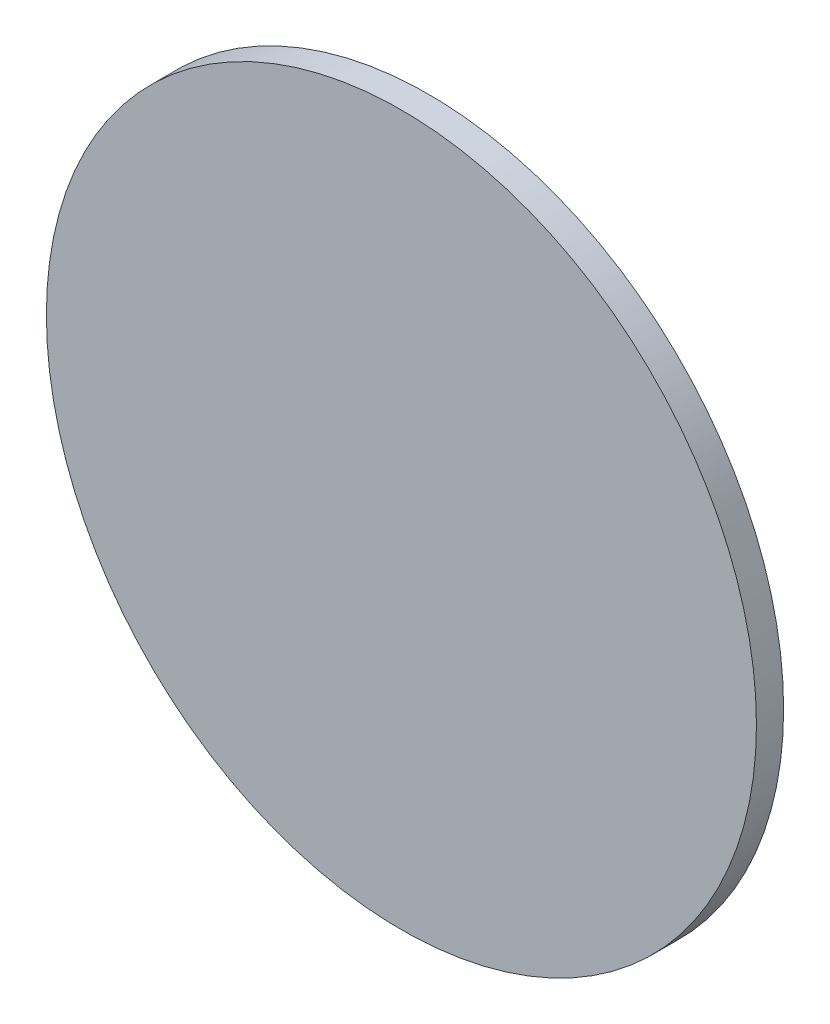
ISO-10303-21;
HEADER;
FILE_DESCRIPTION(('STEP AP214'),'2;1');
FILE_NAME('part.step','',(''),(''),'','','');
FILE_SCHEMA(('AUTOMOTIVE_DESIGN { 1 0 10303 214 1 1 1 1 }'));
ENDSEC;
DATA;
#1=APPLICATION_CONTEXT('core data for automotive mechanical design processes');
#2=APPLICATION_PROTOCOL_DEFINITION('international standard','automotive_design',2000,#1);
#3=PRODUCT_CONTEXT('',#1,'mechanical');
#4=PRODUCT('Part','Part','',(#3));
#5=PRODUCT_RELATED_PRODUCT_CATEGORY('part','',(#4));
#6=PRODUCT_DEFINITION_FORMATION('','',#4);
#7=PRODUCT_DEFINITION_CONTEXT('part definition',#1,'design');
#8=PRODUCT_DEFINITION('design','',#6,#7);
#9=PRODUCT_DEFINITION_SHAPE('','',#8);
#10=(LENGTH_UNIT() NAMED_UNIT(*) SI_UNIT(.MILLI.,.METRE.));
#11=(NAMED_UNIT(*) PLANE_ANGLE_UNIT() SI_UNIT($,.RADIAN.));
#12=(NAMED_UNIT(*) SI_UNIT($,.STERADIAN.) SOLID_ANGLE_UNIT());
#13=UNCERTAINTY_MEASURE_WITH_UNIT(LENGTH_MEASURE(1.E-05),#10,'distance_accuracy_value','');
#14=(GEOMETRIC_REPRESENTATION_CONTEXT(3) GLOBAL_UNCERTAINTY_ASSIGNED_CONTEXT((#13)) GLOBAL_UNIT_ASSIGNED_CONTEXT((#10,
#11,#12)) REPRESENTATION_CONTEXT('',''));
#15=CARTESIAN_POINT('',(0.,0.,0.));
#16=DIRECTION('',(0.,0.,1.));
#17=DIRECTION('',(1.,0.,0.));
#18=AXIS2_PLACEMENT_3D('',#15,#16,#17);
#19=CARTESIAN_POINT('',(0.,0.,1.6));
#20=DIRECTION('',(0.,0.,-1.));
#21=DIRECTION('',(-1.,0.,0.));
#22=AXIS2_PLACEMENT_3D('',#19,#20,#21);
#23=CYLINDRICAL_SURFACE('',#22,20.9);
#24=CARTESIAN_POINT('',(0.,0.,1.6));
#25=DIRECTION('',(0.,0.,1.));
#26=DIRECTION('',(1.,0.,0.));
#27=AXIS2_PLACEMENT_3D('',#24,#25,#26);
#28=CIRCLE('',#27,20.9);
#29=CARTESIAN_POINT('',(20.9,0.,1.6));
#30=VERTEX_POINT('',#29);
#31=EDGE_CURVE('E10',#30,#30,#28,.T.);
#32=ORIENTED_EDGE('',*,*,#31,.F.);
#33=EDGE_LOOP('',(#32));
#34=FACE_BOUND('',#33,.T.);
#35=CARTESIAN_POINT('',(0.,0.,0.));
#36=DIRECTION('',(0.,0.,1.));
#37=DIRECTION('',(1.,0.,0.));
#38=AXIS2_PLACEMENT_3D('',#35,#36,#37);
#39=CIRCLE('',#38,20.9);
#40=CARTESIAN_POINT('',(20.9,0.,0.));
#41=VERTEX_POINT('',#40);
#42=EDGE_CURVE('E35',#41,#41,#39,.T.);
#43=ORIENTED_EDGE('',*,*,#42,.T.);
#44=EDGE_LOOP('',(#43));
#45=FACE_BOUND('',#44,.T.);
#46=ADVANCED_FACE('F32',(#34,#45),#23,.T.);
#47=CARTESIAN_POINT('',(0.,0.,1.6));
#48=DIRECTION('',(0.,0.,1.));
#49=DIRECTION('',(1.,0.,0.));
#50=AXIS2_PLACEMENT_3D('',#47,#48,#49);
#51=PLANE('',#50);
#52=ORIENTED_EDGE('',*,*,#31,.T.);
#53=EDGE_LOOP('',(#52));
#54=FACE_BOUND('',#53,.T.);
#55=ADVANCED_FACE('F47',(#54),#51,.T.);
#56=CARTESIAN_POINT('',(0.,0.,0.));
#57=DIRECTION('',(0.,0.,1.));
#58=DIRECTION('',(1.,0.,0.));
#59=AXIS2_PLACEMENT_3D('',#56,#57,#58);
#60=PLANE('',#59);
#61=ORIENTED_EDGE('',*,*,#42,.F.);
#62=EDGE_LOOP('',(#61));
#63=FACE_BOUND('',#62,.T.);
#64=ADVANCED_FACE('F45',(#63),#60,.F.);
#65=CLOSED_SHELL('',(#46,#55,#64));
#66=MANIFOLD_SOLID_BREP('B2',#65);
#67=ADVANCED_BREP_SHAPE_REPRESENTATION('',(#18,#66),#14);
#68=SHAPE_DEFINITION_REPRESENTATION(#9,#67);
ENDSEC;
END-ISO-10303-21;
